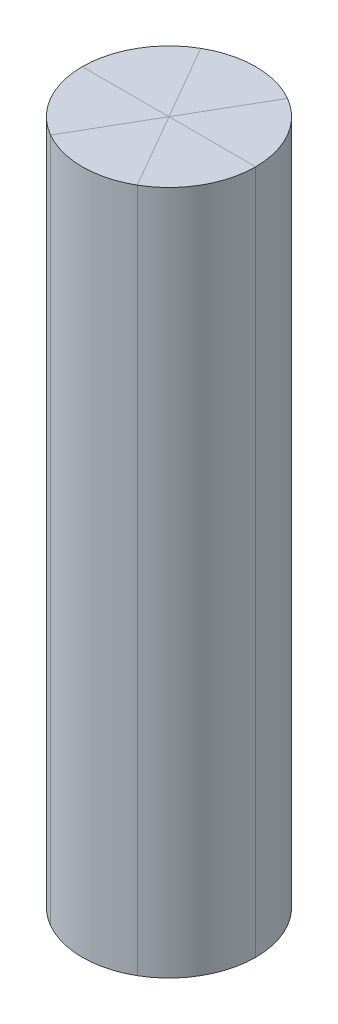
ISO-10303-21;
HEADER;
FILE_DESCRIPTION(('STEP AP214'),'2;1');
FILE_NAME('part.step','',(''),(''),'','','');
FILE_SCHEMA(('AUTOMOTIVE_DESIGN { 1 0 10303 214 1 1 1 1 }'));
ENDSEC;
DATA;
#1=APPLICATION_CONTEXT('core data for automotive mechanical design processes');
#2=APPLICATION_PROTOCOL_DEFINITION('international standard','automotive_design',2000,#1);
#3=PRODUCT_CONTEXT('',#1,'mechanical');
#4=PRODUCT('Part','Part','',(#3));
#5=PRODUCT_RELATED_PRODUCT_CATEGORY('part','',(#4));
#6=PRODUCT_DEFINITION_FORMATION('','',#4);
#7=PRODUCT_DEFINITION_CONTEXT('part definition',#1,'design');
#8=PRODUCT_DEFINITION('design','',#6,#7);
#9=PRODUCT_DEFINITION_SHAPE('','',#8);
#10=(LENGTH_UNIT() NAMED_UNIT(*) SI_UNIT(.MILLI.,.METRE.));
#11=(NAMED_UNIT(*) PLANE_ANGLE_UNIT() SI_UNIT($,.RADIAN.));
#12=(NAMED_UNIT(*) SI_UNIT($,.STERADIAN.) SOLID_ANGLE_UNIT());
#13=UNCERTAINTY_MEASURE_WITH_UNIT(LENGTH_MEASURE(1.E-05),#10,'distance_accuracy_value','');
#14=(GEOMETRIC_REPRESENTATION_CONTEXT(3) GLOBAL_UNCERTAINTY_ASSIGNED_CONTEXT((#13)) GLOBAL_UNIT_ASSIGNED_CONTEXT((#10,
#11,#12)) REPRESENTATION_CONTEXT('',''));
#15=CARTESIAN_POINT('',(0.,0.,0.));
#16=DIRECTION('',(0.,0.,1.));
#17=DIRECTION('',(1.,0.,0.));
#18=AXIS2_PLACEMENT_3D('',#15,#16,#17);
#19=CARTESIAN_POINT('',(0.,0.,0.));
#20=DIRECTION('',(-0.866025403784436,0.,-0.500000000000004));
#21=DIRECTION('',(-0.500000000000004,0.,0.866025403784436));
#22=AXIS2_PLACEMENT_3D('',#19,#20,#21);
#23=PLANE('',#22);
#24=DIRECTION('',(-0.500000000000004,0.,0.866025403784436));
#25=VECTOR('',#24,1.);
#26=CARTESIAN_POINT('',(0.,300.,0.));
#27=LINE('',#26,#25);
#28=CARTESIAN_POINT('',(19.0000000000002,300.,-32.9089653438086));
#29=VERTEX_POINT('',#28);
#30=CARTESIAN_POINT('',(0.,300.,0.));
#31=VERTEX_POINT('',#30);
#32=EDGE_CURVE('E97',#29,#31,#27,.T.);
#33=ORIENTED_EDGE('',*,*,#32,.F.);
#34=DIRECTION('',(0.,-1.,0.));
#35=VECTOR('',#34,1.);
#36=CARTESIAN_POINT('',(19.0000000000002,300.,-32.9089653438086));
#37=LINE('',#36,#35);
#38=CARTESIAN_POINT('',(19.0000000000002,0.,-32.9089653438086));
#39=VERTEX_POINT('',#38);
#40=EDGE_CURVE('E88',#29,#39,#37,.T.);
#41=ORIENTED_EDGE('',*,*,#40,.T.);
#42=DIRECTION('',(-0.500000000000004,0.,0.866025403784436));
#43=VECTOR('',#42,1.);
#44=CARTESIAN_POINT('',(0.,0.,0.));
#45=LINE('',#44,#43);
#46=CARTESIAN_POINT('',(0.,0.,0.));
#47=VERTEX_POINT('',#46);
#48=EDGE_CURVE('E96',#39,#47,#45,.T.);
#49=ORIENTED_EDGE('',*,*,#48,.T.);
#50=DIRECTION('',(0.,-1.,0.));
#51=VECTOR('',#50,1.);
#52=CARTESIAN_POINT('',(0.,0.,0.));
#53=LINE('',#52,#51);
#54=EDGE_CURVE('E12',#31,#47,#53,.T.);
#55=ORIENTED_EDGE('',*,*,#54,.F.);
#56=EDGE_LOOP('',(#33,#41,#49,#55));
#57=FACE_BOUND('',#56,.T.);
#58=ADVANCED_FACE('F52',(#57),#23,.T.);
#59=CARTESIAN_POINT('',(0.,300.,0.));
#60=DIRECTION('',(0.,-1.,0.));
#61=DIRECTION('',(0.,0.,-1.));
#62=AXIS2_PLACEMENT_3D('',#59,#60,#61);
#63=CYLINDRICAL_SURFACE('',#62,38.);
#64=ORIENTED_EDGE('',*,*,#40,.F.);
#65=CARTESIAN_POINT('',(0.,300.,0.));
#66=DIRECTION('',(0.,1.,0.));
#67=DIRECTION('',(0.,0.,1.));
#68=AXIS2_PLACEMENT_3D('',#65,#66,#67);
#69=CIRCLE('',#68,38.);
#70=CARTESIAN_POINT('',(38.,300.,0.));
#71=VERTEX_POINT('',#70);
#72=EDGE_CURVE('E95',#71,#29,#69,.T.);
#73=ORIENTED_EDGE('',*,*,#72,.F.);
#74=DIRECTION('',(0.,-1.,0.));
#75=VECTOR('',#74,1.);
#76=CARTESIAN_POINT('',(38.,300.,0.));
#77=LINE('',#76,#75);
#78=CARTESIAN_POINT('',(38.,0.,0.));
#79=VERTEX_POINT('',#78);
#80=EDGE_CURVE('E91',#79,#71,#77,.F.);
#81=ORIENTED_EDGE('',*,*,#80,.F.);
#82=CARTESIAN_POINT('',(0.,0.,0.));
#83=DIRECTION('',(0.,1.,0.));
#84=DIRECTION('',(0.,0.,1.));
#85=AXIS2_PLACEMENT_3D('',#82,#83,#84);
#86=CIRCLE('',#85,38.);
#87=EDGE_CURVE('E56',#79,#39,#86,.T.);
#88=ORIENTED_EDGE('',*,*,#87,.T.);
#89=EDGE_LOOP('',(#64,#73,#81,#88));
#90=FACE_BOUND('',#89,.T.);
#91=ADVANCED_FACE('F86',(#90),#63,.T.);
#92=CARTESIAN_POINT('',(0.,300.,0.));
#93=DIRECTION('',(0.,1.,0.));
#94=DIRECTION('',(0.,0.,1.));
#95=AXIS2_PLACEMENT_3D('',#92,#93,#94);
#96=PLANE('',#95);
#97=ORIENTED_EDGE('',*,*,#72,.T.);
#98=ORIENTED_EDGE('',*,*,#32,.T.);
#99=DIRECTION('',(1.,0.,0.));
#100=VECTOR('',#99,1.);
#101=CARTESIAN_POINT('',(0.,300.,0.));
#102=LINE('',#101,#100);
#103=EDGE_CURVE('E103',#31,#71,#102,.T.);
#104=ORIENTED_EDGE('',*,*,#103,.T.);
#105=EDGE_LOOP('',(#97,#98,#104));
#106=FACE_BOUND('',#105,.T.);
#107=ADVANCED_FACE('F54',(#106),#96,.T.);
#108=CARTESIAN_POINT('',(0.,0.,0.));
#109=DIRECTION('',(0.,1.,0.));
#110=DIRECTION('',(0.,0.,1.));
#111=AXIS2_PLACEMENT_3D('',#108,#109,#110);
#112=PLANE('',#111);
#113=ORIENTED_EDGE('',*,*,#48,.F.);
#114=ORIENTED_EDGE('',*,*,#87,.F.);
#115=DIRECTION('',(1.,0.,0.));
#116=VECTOR('',#115,1.);
#117=CARTESIAN_POINT('',(0.,0.,0.));
#118=LINE('',#117,#116);
#119=EDGE_CURVE('E100',#47,#79,#118,.T.);
#120=ORIENTED_EDGE('',*,*,#119,.F.);
#121=EDGE_LOOP('',(#113,#114,#120));
#122=FACE_BOUND('',#121,.T.);
#123=ADVANCED_FACE('F99',(#122),#112,.F.);
#124=CARTESIAN_POINT('',(0.,0.,0.));
#125=DIRECTION('',(0.,0.,1.));
#126=DIRECTION('',(1.,0.,0.));
#127=AXIS2_PLACEMENT_3D('',#124,#125,#126);
#128=PLANE('',#127);
#129=ORIENTED_EDGE('',*,*,#103,.F.);
#130=ORIENTED_EDGE('',*,*,#54,.T.);
#131=ORIENTED_EDGE('',*,*,#119,.T.);
#132=ORIENTED_EDGE('',*,*,#80,.T.);
#133=EDGE_LOOP('',(#129,#130,#131,#132));
#134=FACE_BOUND('',#133,.T.);
#135=ADVANCED_FACE('F108',(#134),#128,.T.);
#136=CLOSED_SHELL('',(#58,#91,#107,#123,#135));
#137=MANIFOLD_SOLID_BREP('B2',#136);
#138=CARTESIAN_POINT('',(0.,0.,0.));
#139=DIRECTION('',(-0.866025403784436,0.,-0.500000000000004));
#140=DIRECTION('',(-0.500000000000004,0.,0.866025403784436));
#141=AXIS2_PLACEMENT_3D('',#138,#139,#140);
#142=PLANE('',#141);
#143=DIRECTION('',(-0.500000000000004,0.,0.866025403784436));
#144=VECTOR('',#143,1.);
#145=CARTESIAN_POINT('',(0.,300.,0.));
#146=LINE('',#145,#144);
#147=CARTESIAN_POINT('',(19.0000000000002,300.,-32.9089653438086));
#148=VERTEX_POINT('',#147);
#149=CARTESIAN_POINT('',(0.,300.,0.));
#150=VERTEX_POINT('',#149);
#151=EDGE_CURVE('E169',#148,#150,#146,.T.);
#152=ORIENTED_EDGE('',*,*,#151,.T.);
#153=DIRECTION('',(0.,-1.,0.));
#154=VECTOR('',#153,1.);
#155=CARTESIAN_POINT('',(0.,0.,0.));
#156=LINE('',#155,#154);
#157=CARTESIAN_POINT('',(0.,0.,0.));
#158=VERTEX_POINT('',#157);
#159=EDGE_CURVE('E50',#150,#158,#156,.T.);
#160=ORIENTED_EDGE('',*,*,#159,.T.);
#161=DIRECTION('',(-0.500000000000004,0.,0.866025403784436));
#162=VECTOR('',#161,1.);
#163=CARTESIAN_POINT('',(0.,0.,0.));
#164=LINE('',#163,#162);
#165=CARTESIAN_POINT('',(19.0000000000002,0.,-32.9089653438086));
#166=VERTEX_POINT('',#165);
#167=EDGE_CURVE('E182',#166,#158,#164,.T.);
#168=ORIENTED_EDGE('',*,*,#167,.F.);
#169=DIRECTION('',(0.,-1.,0.));
#170=VECTOR('',#169,1.);
#171=CARTESIAN_POINT('',(19.0000000000002,300.,-32.9089653438086));
#172=LINE('',#171,#170);
#173=EDGE_CURVE('E207',#148,#166,#172,.T.);
#174=ORIENTED_EDGE('',*,*,#173,.F.);
#175=EDGE_LOOP('',(#152,#160,#168,#174));
#176=FACE_BOUND('',#175,.T.);
#177=ADVANCED_FACE('F166',(#176),#142,.F.);
#178=CARTESIAN_POINT('',(0.,0.,0.));
#179=DIRECTION('',(-0.86602540378444,0.,0.499999999999998));
#180=DIRECTION('',(0.499999999999998,0.,0.86602540378444));
#181=AXIS2_PLACEMENT_3D('',#178,#179,#180);
#182=PLANE('',#181);
#183=DIRECTION('',(0.499999999999998,0.,0.86602540378444));
#184=VECTOR('',#183,1.);
#185=CARTESIAN_POINT('',(0.,300.,0.));
#186=LINE('',#185,#184);
#187=CARTESIAN_POINT('',(-18.9999999999999,300.,-32.9089653438087));
#188=VERTEX_POINT('',#187);
#189=EDGE_CURVE('E210',#188,#150,#186,.T.);
#190=ORIENTED_EDGE('',*,*,#189,.F.);
#191=DIRECTION('',(0.,-1.,0.));
#192=VECTOR('',#191,1.);
#193=CARTESIAN_POINT('',(-18.9999999999999,300.,-32.9089653438087));
#194=LINE('',#193,#192);
#195=CARTESIAN_POINT('',(-18.9999999999999,0.,-32.9089653438087));
#196=VERTEX_POINT('',#195);
#197=EDGE_CURVE('E206',#188,#196,#194,.T.);
#198=ORIENTED_EDGE('',*,*,#197,.T.);
#199=DIRECTION('',(0.499999999999998,0.,0.86602540378444));
#200=VECTOR('',#199,1.);
#201=CARTESIAN_POINT('',(0.,0.,0.));
#202=LINE('',#201,#200);
#203=EDGE_CURVE('E213',#196,#158,#202,.T.);
#204=ORIENTED_EDGE('',*,*,#203,.T.);
#205=ORIENTED_EDGE('',*,*,#159,.F.);
#206=EDGE_LOOP('',(#190,#198,#204,#205));
#207=FACE_BOUND('',#206,.T.);
#208=ADVANCED_FACE('F212',(#207),#182,.T.);
#209=CARTESIAN_POINT('',(0.,300.,0.));
#210=DIRECTION('',(0.,-1.,0.));
#211=DIRECTION('',(0.,0.,-1.));
#212=AXIS2_PLACEMENT_3D('',#209,#210,#211);
#213=CYLINDRICAL_SURFACE('',#212,38.);
#214=CARTESIAN_POINT('',(0.,300.,0.));
#215=DIRECTION('',(0.,1.,0.));
#216=DIRECTION('',(0.,0.,1.));
#217=AXIS2_PLACEMENT_3D('',#214,#215,#216);
#218=CIRCLE('',#217,38.);
#219=EDGE_CURVE('E209',#148,#188,#218,.T.);
#220=ORIENTED_EDGE('',*,*,#219,.F.);
#221=ORIENTED_EDGE('',*,*,#173,.T.);
#222=CARTESIAN_POINT('',(0.,0.,0.));
#223=DIRECTION('',(0.,1.,0.));
#224=DIRECTION('',(0.,0.,1.));
#225=AXIS2_PLACEMENT_3D('',#222,#223,#224);
#226=CIRCLE('',#225,38.);
#227=EDGE_CURVE('E202',#166,#196,#226,.T.);
#228=ORIENTED_EDGE('',*,*,#227,.T.);
#229=ORIENTED_EDGE('',*,*,#197,.F.);
#230=EDGE_LOOP('',(#220,#221,#228,#229));
#231=FACE_BOUND('',#230,.T.);
#232=ADVANCED_FACE('F205',(#231),#213,.T.);
#233=CARTESIAN_POINT('',(0.,0.,0.));
#234=DIRECTION('',(0.,1.,0.));
#235=DIRECTION('',(0.,0.,1.));
#236=AXIS2_PLACEMENT_3D('',#233,#234,#235);
#237=PLANE('',#236);
#238=ORIENTED_EDGE('',*,*,#227,.F.);
#239=ORIENTED_EDGE('',*,*,#167,.T.);
#240=ORIENTED_EDGE('',*,*,#203,.F.);
#241=EDGE_LOOP('',(#238,#239,#240));
#242=FACE_BOUND('',#241,.T.);
#243=ADVANCED_FACE('F217',(#242),#237,.F.);
#244=CARTESIAN_POINT('',(0.,300.,0.));
#245=DIRECTION('',(0.,1.,0.));
#246=DIRECTION('',(0.,0.,1.));
#247=AXIS2_PLACEMENT_3D('',#244,#245,#246);
#248=PLANE('',#247);
#249=ORIENTED_EDGE('',*,*,#151,.F.);
#250=ORIENTED_EDGE('',*,*,#219,.T.);
#251=ORIENTED_EDGE('',*,*,#189,.T.);
#252=EDGE_LOOP('',(#249,#250,#251));
#253=FACE_BOUND('',#252,.T.);
#254=ADVANCED_FACE('F229',(#253),#248,.T.);
#255=CLOSED_SHELL('',(#177,#208,#232,#243,#254));
#256=MANIFOLD_SOLID_BREP('B6',#255);
#257=CARTESIAN_POINT('',(0.,0.,0.));
#258=DIRECTION('',(-0.866025403784436,0.,-0.500000000000004));
#259=DIRECTION('',(-0.500000000000004,0.,0.866025403784436));
#260=AXIS2_PLACEMENT_3D('',#257,#258,#259);
#261=PLANE('',#260);
#262=DIRECTION('',(0.,-1.,0.));
#263=VECTOR('',#262,1.);
#264=CARTESIAN_POINT('',(0.,0.,0.));
#265=LINE('',#264,#263);
#266=CARTESIAN_POINT('',(0.,300.,0.));
#267=VERTEX_POINT('',#266);
#268=CARTESIAN_POINT('',(0.,0.,0.));
#269=VERTEX_POINT('',#268);
#270=EDGE_CURVE('E326',#267,#269,#265,.T.);
#271=ORIENTED_EDGE('',*,*,#270,.T.);
#272=DIRECTION('',(-0.500000000000004,0.,0.866025403784436));
#273=VECTOR('',#272,1.);
#274=CARTESIAN_POINT('',(0.,0.,0.));
#275=LINE('',#274,#273);
#276=CARTESIAN_POINT('',(-19.0000000000002,0.,32.9089653438086));
#277=VERTEX_POINT('',#276);
#278=EDGE_CURVE('E331',#269,#277,#275,.T.);
#279=ORIENTED_EDGE('',*,*,#278,.T.);
#280=DIRECTION('',(0.,-1.,0.));
#281=VECTOR('',#280,1.);
#282=CARTESIAN_POINT('',(-19.0000000000002,300.,32.9089653438086));
#283=LINE('',#282,#281);
#284=CARTESIAN_POINT('',(-19.0000000000002,300.,32.9089653438086));
#285=VERTEX_POINT('',#284);
#286=EDGE_CURVE('E335',#277,#285,#283,.F.);
#287=ORIENTED_EDGE('',*,*,#286,.T.);
#288=DIRECTION('',(-0.500000000000004,0.,0.866025403784436));
#289=VECTOR('',#288,1.);
#290=CARTESIAN_POINT('',(0.,300.,0.));
#291=LINE('',#290,#289);
#292=EDGE_CURVE('E338',#267,#285,#291,.T.);
#293=ORIENTED_EDGE('',*,*,#292,.F.);
#294=EDGE_LOOP('',(#271,#279,#287,#293));
#295=FACE_BOUND('',#294,.T.);
#296=ADVANCED_FACE('F289',(#295),#261,.T.);
#297=CARTESIAN_POINT('',(0.,300.,0.));
#298=DIRECTION('',(0.,-1.,0.));
#299=DIRECTION('',(0.,0.,-1.));
#300=AXIS2_PLACEMENT_3D('',#297,#298,#299);
#301=CYLINDRICAL_SURFACE('',#300,38.);
#302=ORIENTED_EDGE('',*,*,#286,.F.);
#303=CARTESIAN_POINT('',(0.,0.,0.));
#304=DIRECTION('',(0.,1.,0.));
#305=DIRECTION('',(0.,0.,1.));
#306=AXIS2_PLACEMENT_3D('',#303,#304,#305);
#307=CIRCLE('',#306,38.);
#308=CARTESIAN_POINT('',(18.9999999999999,0.,32.9089653438087));
#309=VERTEX_POINT('',#308);
#310=EDGE_CURVE('E164',#277,#309,#307,.T.);
#311=ORIENTED_EDGE('',*,*,#310,.T.);
#312=DIRECTION('',(0.,-1.,0.));
#313=VECTOR('',#312,1.);
#314=CARTESIAN_POINT('',(18.9999999999999,300.,32.9089653438087));
#315=LINE('',#314,#313);
#316=CARTESIAN_POINT('',(18.9999999999999,300.,32.9089653438087));
#317=VERTEX_POINT('',#316);
#318=EDGE_CURVE('E327',#309,#317,#315,.F.);
#319=ORIENTED_EDGE('',*,*,#318,.T.);
#320=CARTESIAN_POINT('',(0.,300.,0.));
#321=DIRECTION('',(0.,1.,0.));
#322=DIRECTION('',(0.,0.,1.));
#323=AXIS2_PLACEMENT_3D('',#320,#321,#322);
#324=CIRCLE('',#323,38.);
#325=EDGE_CURVE('E297',#285,#317,#324,.T.);
#326=ORIENTED_EDGE('',*,*,#325,.F.);
#327=EDGE_LOOP('',(#302,#311,#319,#326));
#328=FACE_BOUND('',#327,.T.);
#329=ADVANCED_FACE('F345',(#328),#301,.T.);
#330=CARTESIAN_POINT('',(0.,0.,0.));
#331=DIRECTION('',(-0.86602540378444,0.,0.499999999999998));
#332=DIRECTION('',(0.499999999999998,0.,0.86602540378444));
#333=AXIS2_PLACEMENT_3D('',#330,#331,#332);
#334=PLANE('',#333);
#335=ORIENTED_EDGE('',*,*,#270,.F.);
#336=DIRECTION('',(0.499999999999998,0.,0.86602540378444));
#337=VECTOR('',#336,1.);
#338=CARTESIAN_POINT('',(0.,300.,0.));
#339=LINE('',#338,#337);
#340=EDGE_CURVE('E343',#267,#317,#339,.T.);
#341=ORIENTED_EDGE('',*,*,#340,.T.);
#342=ORIENTED_EDGE('',*,*,#318,.F.);
#343=DIRECTION('',(0.499999999999998,0.,0.86602540378444));
#344=VECTOR('',#343,1.);
#345=CARTESIAN_POINT('',(0.,0.,0.));
#346=LINE('',#345,#344);
#347=EDGE_CURVE('E321',#269,#309,#346,.T.);
#348=ORIENTED_EDGE('',*,*,#347,.F.);
#349=EDGE_LOOP('',(#335,#341,#342,#348));
#350=FACE_BOUND('',#349,.T.);
#351=ADVANCED_FACE('F323',(#350),#334,.F.);
#352=CARTESIAN_POINT('',(0.,300.,0.));
#353=DIRECTION('',(0.,1.,0.));
#354=DIRECTION('',(0.,0.,1.));
#355=AXIS2_PLACEMENT_3D('',#352,#353,#354);
#356=PLANE('',#355);
#357=ORIENTED_EDGE('',*,*,#340,.F.);
#358=ORIENTED_EDGE('',*,*,#292,.T.);
#359=ORIENTED_EDGE('',*,*,#325,.T.);
#360=EDGE_LOOP('',(#357,#358,#359));
#361=FACE_BOUND('',#360,.T.);
#362=ADVANCED_FACE('F291',(#361),#356,.T.);
#363=CARTESIAN_POINT('',(0.,0.,0.));
#364=DIRECTION('',(0.,1.,0.));
#365=DIRECTION('',(0.,0.,1.));
#366=AXIS2_PLACEMENT_3D('',#363,#364,#365);
#367=PLANE('',#366);
#368=ORIENTED_EDGE('',*,*,#278,.F.);
#369=ORIENTED_EDGE('',*,*,#347,.T.);
#370=ORIENTED_EDGE('',*,*,#310,.F.);
#371=EDGE_LOOP('',(#368,#369,#370));
#372=FACE_BOUND('',#371,.T.);
#373=ADVANCED_FACE('F332',(#372),#367,.F.);
#374=CLOSED_SHELL('',(#296,#329,#351,#362,#373));
#375=MANIFOLD_SOLID_BREP('B44',#374);
#376=CARTESIAN_POINT('',(0.,0.,0.));
#377=DIRECTION('',(-0.866025403784436,0.,-0.500000000000004));
#378=DIRECTION('',(-0.500000000000004,0.,0.866025403784436));
#379=AXIS2_PLACEMENT_3D('',#376,#377,#378);
#380=PLANE('',#379);
#381=DIRECTION('',(0.,-1.,0.));
#382=VECTOR('',#381,1.);
#383=CARTESIAN_POINT('',(0.,0.,0.));
#384=LINE('',#383,#382);
#385=CARTESIAN_POINT('',(0.,300.,0.));
#386=VERTEX_POINT('',#385);
#387=CARTESIAN_POINT('',(0.,0.,0.));
#388=VERTEX_POINT('',#387);
#389=EDGE_CURVE('E450',#386,#388,#384,.T.);
#390=ORIENTED_EDGE('',*,*,#389,.F.);
#391=DIRECTION('',(-0.500000000000004,0.,0.866025403784436));
#392=VECTOR('',#391,1.);
#393=CARTESIAN_POINT('',(0.,300.,0.));
#394=LINE('',#393,#392);
#395=CARTESIAN_POINT('',(-19.0000000000002,300.,32.9089653438086));
#396=VERTEX_POINT('',#395);
#397=EDGE_CURVE('E287',#386,#396,#394,.T.);
#398=ORIENTED_EDGE('',*,*,#397,.T.);
#399=DIRECTION('',(0.,-1.,0.));
#400=VECTOR('',#399,1.);
#401=CARTESIAN_POINT('',(-19.0000000000002,300.,32.9089653438086));
#402=LINE('',#401,#400);
#403=CARTESIAN_POINT('',(-19.0000000000002,0.,32.9089653438086));
#404=VERTEX_POINT('',#403);
#405=EDGE_CURVE('E411',#404,#396,#402,.F.);
#406=ORIENTED_EDGE('',*,*,#405,.F.);
#407=DIRECTION('',(-0.500000000000004,0.,0.866025403784436));
#408=VECTOR('',#407,1.);
#409=CARTESIAN_POINT('',(0.,0.,0.));
#410=LINE('',#409,#408);
#411=EDGE_CURVE('E406',#388,#404,#410,.T.);
#412=ORIENTED_EDGE('',*,*,#411,.F.);
#413=EDGE_LOOP('',(#390,#398,#406,#412));
#414=FACE_BOUND('',#413,.T.);
#415=ADVANCED_FACE('F403',(#414),#380,.F.);
#416=CARTESIAN_POINT('',(0.,0.,0.));
#417=DIRECTION('',(0.,0.,1.));
#418=DIRECTION('',(1.,0.,0.));
#419=AXIS2_PLACEMENT_3D('',#416,#417,#418);
#420=PLANE('',#419);
#421=DIRECTION('',(1.,0.,0.));
#422=VECTOR('',#421,1.);
#423=CARTESIAN_POINT('',(0.,300.,0.));
#424=LINE('',#423,#422);
#425=CARTESIAN_POINT('',(-38.,300.,0.));
#426=VERTEX_POINT('',#425);
#427=EDGE_CURVE('E444',#426,#386,#424,.T.);
#428=ORIENTED_EDGE('',*,*,#427,.T.);
#429=ORIENTED_EDGE('',*,*,#389,.T.);
#430=DIRECTION('',(1.,0.,0.));
#431=VECTOR('',#430,1.);
#432=CARTESIAN_POINT('',(0.,0.,0.));
#433=LINE('',#432,#431);
#434=CARTESIAN_POINT('',(-38.,0.,0.));
#435=VERTEX_POINT('',#434);
#436=EDGE_CURVE('E445',#435,#388,#433,.T.);
#437=ORIENTED_EDGE('',*,*,#436,.F.);
#438=DIRECTION('',(0.,-1.,0.));
#439=VECTOR('',#438,1.);
#440=CARTESIAN_POINT('',(-38.,300.,0.));
#441=LINE('',#440,#439);
#442=EDGE_CURVE('E435',#426,#435,#441,.T.);
#443=ORIENTED_EDGE('',*,*,#442,.F.);
#444=EDGE_LOOP('',(#428,#429,#437,#443));
#445=FACE_BOUND('',#444,.T.);
#446=ADVANCED_FACE('F448',(#445),#420,.F.);
#447=CARTESIAN_POINT('',(0.,300.,0.));
#448=DIRECTION('',(0.,-1.,0.));
#449=DIRECTION('',(0.,0.,-1.));
#450=AXIS2_PLACEMENT_3D('',#447,#448,#449);
#451=CYLINDRICAL_SURFACE('',#450,38.);
#452=CARTESIAN_POINT('',(0.,0.,0.));
#453=DIRECTION('',(0.,1.,0.));
#454=DIRECTION('',(0.,0.,1.));
#455=AXIS2_PLACEMENT_3D('',#452,#453,#454);
#456=CIRCLE('',#455,38.);
#457=EDGE_CURVE('E438',#435,#404,#456,.T.);
#458=ORIENTED_EDGE('',*,*,#457,.T.);
#459=ORIENTED_EDGE('',*,*,#405,.T.);
#460=CARTESIAN_POINT('',(0.,300.,0.));
#461=DIRECTION('',(0.,1.,0.));
#462=DIRECTION('',(0.,0.,1.));
#463=AXIS2_PLACEMENT_3D('',#460,#461,#462);
#464=CIRCLE('',#463,38.);
#465=EDGE_CURVE('E440',#426,#396,#464,.T.);
#466=ORIENTED_EDGE('',*,*,#465,.F.);
#467=ORIENTED_EDGE('',*,*,#442,.T.);
#468=EDGE_LOOP('',(#458,#459,#466,#467));
#469=FACE_BOUND('',#468,.T.);
#470=ADVANCED_FACE('F437',(#469),#451,.T.);
#471=CARTESIAN_POINT('',(0.,0.,0.));
#472=DIRECTION('',(0.,1.,0.));
#473=DIRECTION('',(0.,0.,1.));
#474=AXIS2_PLACEMENT_3D('',#471,#472,#473);
#475=PLANE('',#474);
#476=ORIENTED_EDGE('',*,*,#436,.T.);
#477=ORIENTED_EDGE('',*,*,#411,.T.);
#478=ORIENTED_EDGE('',*,*,#457,.F.);
#479=EDGE_LOOP('',(#476,#477,#478));
#480=FACE_BOUND('',#479,.T.);
#481=ADVANCED_FACE('F452',(#480),#475,.F.);
#482=CARTESIAN_POINT('',(0.,300.,0.));
#483=DIRECTION('',(0.,1.,0.));
#484=DIRECTION('',(0.,0.,1.));
#485=AXIS2_PLACEMENT_3D('',#482,#483,#484);
#486=PLANE('',#485);
#487=ORIENTED_EDGE('',*,*,#397,.F.);
#488=ORIENTED_EDGE('',*,*,#427,.F.);
#489=ORIENTED_EDGE('',*,*,#465,.T.);
#490=EDGE_LOOP('',(#487,#488,#489));
#491=FACE_BOUND('',#490,.T.);
#492=ADVANCED_FACE('F458',(#491),#486,.T.);
#493=CLOSED_SHELL('',(#415,#446,#470,#481,#492));
#494=MANIFOLD_SOLID_BREP('B158',#493);
#495=CARTESIAN_POINT('',(0.,0.,0.));
#496=DIRECTION('',(-0.86602540378444,0.,0.499999999999998));
#497=DIRECTION('',(0.499999999999998,0.,0.86602540378444));
#498=AXIS2_PLACEMENT_3D('',#495,#496,#497);
#499=PLANE('',#498);
#500=DIRECTION('',(0.,-1.,0.));
#501=VECTOR('',#500,1.);
#502=CARTESIAN_POINT('',(0.,0.,0.));
#503=LINE('',#502,#501);
#504=CARTESIAN_POINT('',(0.,300.,0.));
#505=VERTEX_POINT('',#504);
#506=CARTESIAN_POINT('',(0.,0.,0.));
#507=VERTEX_POINT('',#506);
#508=EDGE_CURVE('E558',#505,#507,#503,.T.);
#509=ORIENTED_EDGE('',*,*,#508,.T.);
#510=DIRECTION('',(0.499999999999998,0.,0.86602540378444));
#511=VECTOR('',#510,1.);
#512=CARTESIAN_POINT('',(0.,0.,0.));
#513=LINE('',#512,#511);
#514=CARTESIAN_POINT('',(18.9999999999999,0.,32.9089653438087));
#515=VERTEX_POINT('',#514);
#516=EDGE_CURVE('E550',#507,#515,#513,.T.);
#517=ORIENTED_EDGE('',*,*,#516,.T.);
#518=DIRECTION('',(0.,-1.,0.));
#519=VECTOR('',#518,1.);
#520=CARTESIAN_POINT('',(18.9999999999999,300.,32.9089653438087));
#521=LINE('',#520,#519);
#522=CARTESIAN_POINT('',(18.9999999999999,300.,32.9089653438087));
#523=VERTEX_POINT('',#522);
#524=EDGE_CURVE('E555',#515,#523,#521,.F.);
#525=ORIENTED_EDGE('',*,*,#524,.T.);
#526=DIRECTION('',(0.499999999999998,0.,0.86602540378444));
#527=VECTOR('',#526,1.);
#528=CARTESIAN_POINT('',(0.,300.,0.));
#529=LINE('',#528,#527);
#530=EDGE_CURVE('E568',#505,#523,#529,.T.);
#531=ORIENTED_EDGE('',*,*,#530,.F.);
#532=EDGE_LOOP('',(#509,#517,#525,#531));
#533=FACE_BOUND('',#532,.T.);
#534=ADVANCED_FACE('F516',(#533),#499,.T.);
#535=CARTESIAN_POINT('',(0.,300.,0.));
#536=DIRECTION('',(0.,-1.,0.));
#537=DIRECTION('',(0.,0.,-1.));
#538=AXIS2_PLACEMENT_3D('',#535,#536,#537);
#539=CYLINDRICAL_SURFACE('',#538,38.);
#540=ORIENTED_EDGE('',*,*,#524,.F.);
#541=CARTESIAN_POINT('',(0.,0.,0.));
#542=DIRECTION('',(0.,1.,0.));
#543=DIRECTION('',(0.,0.,1.));
#544=AXIS2_PLACEMENT_3D('',#541,#542,#543);
#545=CIRCLE('',#544,38.);
#546=CARTESIAN_POINT('',(38.,0.,0.));
#547=VERTEX_POINT('',#546);
#548=EDGE_CURVE('E401',#515,#547,#545,.T.);
#549=ORIENTED_EDGE('',*,*,#548,.T.);
#550=DIRECTION('',(0.,-1.,0.));
#551=VECTOR('',#550,1.);
#552=CARTESIAN_POINT('',(38.,300.,0.));
#553=LINE('',#552,#551);
#554=CARTESIAN_POINT('',(38.,300.,0.));
#555=VERTEX_POINT('',#554);
#556=EDGE_CURVE('E567',#547,#555,#553,.F.);
#557=ORIENTED_EDGE('',*,*,#556,.T.);
#558=CARTESIAN_POINT('',(0.,300.,0.));
#559=DIRECTION('',(0.,1.,0.));
#560=DIRECTION('',(0.,0.,1.));
#561=AXIS2_PLACEMENT_3D('',#558,#559,#560);
#562=CIRCLE('',#561,38.);
#563=EDGE_CURVE('E524',#523,#555,#562,.T.);
#564=ORIENTED_EDGE('',*,*,#563,.F.);
#565=EDGE_LOOP('',(#540,#549,#557,#564));
#566=FACE_BOUND('',#565,.T.);
#567=ADVANCED_FACE('F556',(#566),#539,.T.);
#568=CARTESIAN_POINT('',(0.,0.,0.));
#569=DIRECTION('',(0.,0.,1.));
#570=DIRECTION('',(1.,0.,0.));
#571=AXIS2_PLACEMENT_3D('',#568,#569,#570);
#572=PLANE('',#571);
#573=ORIENTED_EDGE('',*,*,#508,.F.);
#574=DIRECTION('',(1.,0.,0.));
#575=VECTOR('',#574,1.);
#576=CARTESIAN_POINT('',(0.,300.,0.));
#577=LINE('',#576,#575);
#578=EDGE_CURVE('E565',#505,#555,#577,.T.);
#579=ORIENTED_EDGE('',*,*,#578,.T.);
#580=ORIENTED_EDGE('',*,*,#556,.F.);
#581=DIRECTION('',(1.,0.,0.));
#582=VECTOR('',#581,1.);
#583=CARTESIAN_POINT('',(0.,0.,0.));
#584=LINE('',#583,#582);
#585=EDGE_CURVE('E531',#507,#547,#584,.T.);
#586=ORIENTED_EDGE('',*,*,#585,.F.);
#587=EDGE_LOOP('',(#573,#579,#580,#586));
#588=FACE_BOUND('',#587,.T.);
#589=ADVANCED_FACE('F572',(#588),#572,.F.);
#590=CARTESIAN_POINT('',(0.,300.,0.));
#591=DIRECTION('',(0.,1.,0.));
#592=DIRECTION('',(0.,0.,1.));
#593=AXIS2_PLACEMENT_3D('',#590,#591,#592);
#594=PLANE('',#593);
#595=ORIENTED_EDGE('',*,*,#578,.F.);
#596=ORIENTED_EDGE('',*,*,#530,.T.);
#597=ORIENTED_EDGE('',*,*,#563,.T.);
#598=EDGE_LOOP('',(#595,#596,#597));
#599=FACE_BOUND('',#598,.T.);
#600=ADVANCED_FACE('F518',(#599),#594,.T.);
#601=CARTESIAN_POINT('',(0.,0.,0.));
#602=DIRECTION('',(0.,1.,0.));
#603=DIRECTION('',(0.,0.,1.));
#604=AXIS2_PLACEMENT_3D('',#601,#602,#603);
#605=PLANE('',#604);
#606=ORIENTED_EDGE('',*,*,#516,.F.);
#607=ORIENTED_EDGE('',*,*,#585,.T.);
#608=ORIENTED_EDGE('',*,*,#548,.F.);
#609=EDGE_LOOP('',(#606,#607,#608));
#610=FACE_BOUND('',#609,.T.);
#611=ADVANCED_FACE('F548',(#610),#605,.F.);
#612=CLOSED_SHELL('',(#534,#567,#589,#600,#611));
#613=MANIFOLD_SOLID_BREP('B281',#612);
#614=CARTESIAN_POINT('',(0.,0.,0.));
#615=DIRECTION('',(-0.86602540378444,0.,0.499999999999998));
#616=DIRECTION('',(0.499999999999998,0.,0.86602540378444));
#617=AXIS2_PLACEMENT_3D('',#614,#615,#616);
#618=PLANE('',#617);
#619=DIRECTION('',(0.499999999999998,0.,0.86602540378444));
#620=VECTOR('',#619,1.);
#621=CARTESIAN_POINT('',(0.,300.,0.));
#622=LINE('',#621,#620);
#623=CARTESIAN_POINT('',(-18.9999999999999,300.,-32.9089653438087));
#624=VERTEX_POINT('',#623);
#625=CARTESIAN_POINT('',(0.,300.,0.));
#626=VERTEX_POINT('',#625);
#627=EDGE_CURVE('E514',#624,#626,#622,.T.);
#628=ORIENTED_EDGE('',*,*,#627,.T.);
#629=DIRECTION('',(0.,-1.,0.));
#630=VECTOR('',#629,1.);
#631=CARTESIAN_POINT('',(0.,0.,0.));
#632=LINE('',#631,#630);
#633=CARTESIAN_POINT('',(0.,0.,0.));
#634=VERTEX_POINT('',#633);
#635=EDGE_CURVE('E627',#626,#634,#632,.T.);
#636=ORIENTED_EDGE('',*,*,#635,.T.);
#637=DIRECTION('',(0.499999999999998,0.,0.86602540378444));
#638=VECTOR('',#637,1.);
#639=CARTESIAN_POINT('',(0.,0.,0.));
#640=LINE('',#639,#638);
#641=CARTESIAN_POINT('',(-18.9999999999999,0.,-32.9089653438087));
#642=VERTEX_POINT('',#641);
#643=EDGE_CURVE('E661',#642,#634,#640,.T.);
#644=ORIENTED_EDGE('',*,*,#643,.F.);
#645=DIRECTION('',(0.,-1.,0.));
#646=VECTOR('',#645,1.);
#647=CARTESIAN_POINT('',(-18.9999999999999,300.,-32.9089653438087));
#648=LINE('',#647,#646);
#649=EDGE_CURVE('E633',#624,#642,#648,.T.);
#650=ORIENTED_EDGE('',*,*,#649,.F.);
#651=EDGE_LOOP('',(#628,#636,#644,#650));
#652=FACE_BOUND('',#651,.T.);
#653=ADVANCED_FACE('F620',(#652),#618,.F.);
#654=CARTESIAN_POINT('',(0.,0.,0.));
#655=DIRECTION('',(0.,0.,1.));
#656=DIRECTION('',(1.,0.,0.));
#657=AXIS2_PLACEMENT_3D('',#654,#655,#656);
#658=PLANE('',#657);
#659=ORIENTED_EDGE('',*,*,#635,.F.);
#660=DIRECTION('',(1.,0.,0.));
#661=VECTOR('',#660,1.);
#662=CARTESIAN_POINT('',(0.,300.,0.));
#663=LINE('',#662,#661);
#664=CARTESIAN_POINT('',(-38.,300.,0.));
#665=VERTEX_POINT('',#664);
#666=EDGE_CURVE('E667',#665,#626,#663,.T.);
#667=ORIENTED_EDGE('',*,*,#666,.F.);
#668=DIRECTION('',(0.,-1.,0.));
#669=VECTOR('',#668,1.);
#670=CARTESIAN_POINT('',(-38.,300.,0.));
#671=LINE('',#670,#669);
#672=CARTESIAN_POINT('',(-38.,0.,0.));
#673=VERTEX_POINT('',#672);
#674=EDGE_CURVE('E658',#665,#673,#671,.T.);
#675=ORIENTED_EDGE('',*,*,#674,.T.);
#676=DIRECTION('',(1.,0.,0.));
#677=VECTOR('',#676,1.);
#678=CARTESIAN_POINT('',(0.,0.,0.));
#679=LINE('',#678,#677);
#680=EDGE_CURVE('E665',#673,#634,#679,.T.);
#681=ORIENTED_EDGE('',*,*,#680,.T.);
#682=EDGE_LOOP('',(#659,#667,#675,#681));
#683=FACE_BOUND('',#682,.T.);
#684=ADVANCED_FACE('F664',(#683),#658,.T.);
#685=CARTESIAN_POINT('',(0.,300.,0.));
#686=DIRECTION('',(0.,-1.,0.));
#687=DIRECTION('',(0.,0.,-1.));
#688=AXIS2_PLACEMENT_3D('',#685,#686,#687);
#689=CYLINDRICAL_SURFACE('',#688,38.);
#690=CARTESIAN_POINT('',(0.,300.,0.));
#691=DIRECTION('',(0.,1.,0.));
#692=DIRECTION('',(0.,0.,1.));
#693=AXIS2_PLACEMENT_3D('',#690,#691,#692);
#694=CIRCLE('',#693,38.);
#695=EDGE_CURVE('E662',#624,#665,#694,.T.);
#696=ORIENTED_EDGE('',*,*,#695,.F.);
#697=ORIENTED_EDGE('',*,*,#649,.T.);
#698=CARTESIAN_POINT('',(0.,0.,0.));
#699=DIRECTION('',(0.,1.,0.));
#700=DIRECTION('',(0.,0.,1.));
#701=AXIS2_PLACEMENT_3D('',#698,#699,#700);
#702=CIRCLE('',#701,38.);
#703=EDGE_CURVE('E654',#642,#673,#702,.T.);
#704=ORIENTED_EDGE('',*,*,#703,.T.);
#705=ORIENTED_EDGE('',*,*,#674,.F.);
#706=EDGE_LOOP('',(#696,#697,#704,#705));
#707=FACE_BOUND('',#706,.T.);
#708=ADVANCED_FACE('F657',(#707),#689,.T.);
#709=CARTESIAN_POINT('',(0.,0.,0.));
#710=DIRECTION('',(0.,1.,0.));
#711=DIRECTION('',(0.,0.,1.));
#712=AXIS2_PLACEMENT_3D('',#709,#710,#711);
#713=PLANE('',#712);
#714=ORIENTED_EDGE('',*,*,#703,.F.);
#715=ORIENTED_EDGE('',*,*,#643,.T.);
#716=ORIENTED_EDGE('',*,*,#680,.F.);
#717=EDGE_LOOP('',(#714,#715,#716));
#718=FACE_BOUND('',#717,.T.);
#719=ADVANCED_FACE('F669',(#718),#713,.F.);
#720=CARTESIAN_POINT('',(0.,300.,0.));
#721=DIRECTION('',(0.,1.,0.));
#722=DIRECTION('',(0.,0.,1.));
#723=AXIS2_PLACEMENT_3D('',#720,#721,#722);
#724=PLANE('',#723);
#725=ORIENTED_EDGE('',*,*,#627,.F.);
#726=ORIENTED_EDGE('',*,*,#695,.T.);
#727=ORIENTED_EDGE('',*,*,#666,.T.);
#728=EDGE_LOOP('',(#725,#726,#727));
#729=FACE_BOUND('',#728,.T.);
#730=ADVANCED_FACE('F676',(#729),#724,.T.);
#731=CLOSED_SHELL('',(#653,#684,#708,#719,#730));
#732=MANIFOLD_SOLID_BREP('B395',#731);
#733=ADVANCED_BREP_SHAPE_REPRESENTATION('',(#18,#137,#256,#375,#494,#613,#732),#14);
#734=SHAPE_DEFINITION_REPRESENTATION(#9,#733);
ENDSEC;
END-ISO-10303-21;
